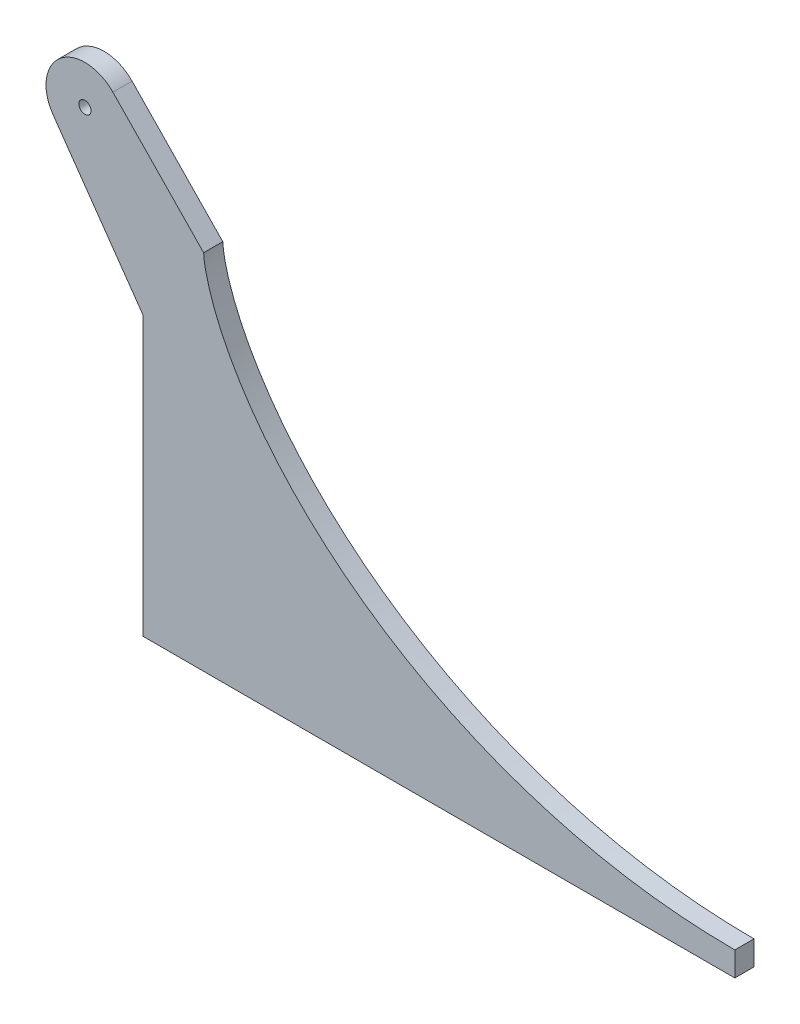
ISO-10303-21;
HEADER;
FILE_DESCRIPTION(('STEP AP214'),'2;1');
FILE_NAME('part.step','',(''),(''),'','','');
FILE_SCHEMA(('AUTOMOTIVE_DESIGN { 1 0 10303 214 1 1 1 1 }'));
ENDSEC;
DATA;
#1=APPLICATION_CONTEXT('core data for automotive mechanical design processes');
#2=APPLICATION_PROTOCOL_DEFINITION('international standard','automotive_design',2000,#1);
#3=PRODUCT_CONTEXT('',#1,'mechanical');
#4=PRODUCT('Part','Part','',(#3));
#5=PRODUCT_RELATED_PRODUCT_CATEGORY('part','',(#4));
#6=PRODUCT_DEFINITION_FORMATION('','',#4);
#7=PRODUCT_DEFINITION_CONTEXT('part definition',#1,'design');
#8=PRODUCT_DEFINITION('design','',#6,#7);
#9=PRODUCT_DEFINITION_SHAPE('','',#8);
#10=(LENGTH_UNIT() NAMED_UNIT(*) SI_UNIT(.MILLI.,.METRE.));
#11=(NAMED_UNIT(*) PLANE_ANGLE_UNIT() SI_UNIT($,.RADIAN.));
#12=(NAMED_UNIT(*) SI_UNIT($,.STERADIAN.) SOLID_ANGLE_UNIT());
#13=UNCERTAINTY_MEASURE_WITH_UNIT(LENGTH_MEASURE(1.E-05),#10,'distance_accuracy_value','');
#14=(GEOMETRIC_REPRESENTATION_CONTEXT(3) GLOBAL_UNCERTAINTY_ASSIGNED_CONTEXT((#13)) GLOBAL_UNIT_ASSIGNED_CONTEXT((#10,
#11,#12)) REPRESENTATION_CONTEXT('',''));
#15=CARTESIAN_POINT('',(0.,0.,0.));
#16=DIRECTION('',(0.,0.,1.));
#17=DIRECTION('',(1.,0.,0.));
#18=AXIS2_PLACEMENT_3D('',#15,#16,#17);
#19=CARTESIAN_POINT('',(-154.481439557848,-6.35,2.5));
#20=DIRECTION('',(0.,1.,0.));
#21=DIRECTION('',(0.,0.,1.));
#22=AXIS2_PLACEMENT_3D('',#19,#20,#21);
#23=PLANE('',#22);
#24=DIRECTION('',(1.,0.,0.));
#25=VECTOR('',#24,1.);
#26=CARTESIAN_POINT('',(-154.481439557848,-6.35,-2.5));
#27=LINE('',#26,#25);
#28=CARTESIAN_POINT('',(-154.481439557848,-6.35,-2.5));
#29=VERTEX_POINT('',#28);
#30=CARTESIAN_POINT('',(0.,-6.35,-2.5));
#31=VERTEX_POINT('',#30);
#32=EDGE_CURVE('E135',#29,#31,#27,.T.);
#33=ORIENTED_EDGE('',*,*,#32,.T.);
#34=DIRECTION('',(0.,0.,-1.));
#35=VECTOR('',#34,1.);
#36=CARTESIAN_POINT('',(0.,-6.35,2.5));
#37=LINE('',#36,#35);
#38=CARTESIAN_POINT('',(0.,-6.35,2.5));
#39=VERTEX_POINT('',#38);
#40=EDGE_CURVE('E13',#39,#31,#37,.T.);
#41=ORIENTED_EDGE('',*,*,#40,.F.);
#42=DIRECTION('',(1.,0.,0.));
#43=VECTOR('',#42,1.);
#44=CARTESIAN_POINT('',(-154.481439557848,-6.35,2.5));
#45=LINE('',#44,#43);
#46=CARTESIAN_POINT('',(-154.481439557848,-6.35,2.5));
#47=VERTEX_POINT('',#46);
#48=EDGE_CURVE('E153',#47,#39,#45,.T.);
#49=ORIENTED_EDGE('',*,*,#48,.F.);
#50=DIRECTION('',(0.,0.,-1.));
#51=VECTOR('',#50,1.);
#52=CARTESIAN_POINT('',(-154.481439557848,-6.35,2.5));
#53=LINE('',#52,#51);
#54=EDGE_CURVE('E131',#47,#29,#53,.T.);
#55=ORIENTED_EDGE('',*,*,#54,.T.);
#56=EDGE_LOOP('',(#33,#41,#49,#55));
#57=FACE_BOUND('',#56,.T.);
#58=ADVANCED_FACE('F45',(#57),#23,.F.);
#59=CARTESIAN_POINT('',(0.,-6.35,2.5));
#60=DIRECTION('',(-1.,0.,0.));
#61=DIRECTION('',(0.,0.,1.));
#62=AXIS2_PLACEMENT_3D('',#59,#60,#61);
#63=PLANE('',#62);
#64=DIRECTION('',(0.,1.,0.));
#65=VECTOR('',#64,1.);
#66=CARTESIAN_POINT('',(0.,-6.35,-2.5));
#67=LINE('',#66,#65);
#68=CARTESIAN_POINT('',(-3.2225814361377E-12,-4.70224750895336E-12,-2.5));
#69=VERTEX_POINT('',#68);
#70=EDGE_CURVE('E138',#31,#69,#67,.T.);
#71=ORIENTED_EDGE('',*,*,#70,.T.);
#72=DIRECTION('',(0.,0.,-1.));
#73=VECTOR('',#72,1.);
#74=CARTESIAN_POINT('',(-3.2225814361377E-12,-4.70224750895336E-12,2.5));
#75=LINE('',#74,#73);
#76=CARTESIAN_POINT('',(-3.2225814361377E-12,-4.70224750895336E-12,2.5));
#77=VERTEX_POINT('',#76);
#78=EDGE_CURVE('E53',#77,#69,#75,.T.);
#79=ORIENTED_EDGE('',*,*,#78,.F.);
#80=DIRECTION('',(0.,1.,0.));
#81=VECTOR('',#80,1.);
#82=CARTESIAN_POINT('',(0.,-6.35,2.5));
#83=LINE('',#82,#81);
#84=EDGE_CURVE('E101',#39,#77,#83,.T.);
#85=ORIENTED_EDGE('',*,*,#84,.F.);
#86=ORIENTED_EDGE('',*,*,#40,.T.);
#87=EDGE_LOOP('',(#71,#79,#85,#86));
#88=FACE_BOUND('',#87,.T.);
#89=ADVANCED_FACE('F184',(#88),#63,.F.);
#90=CARTESIAN_POINT('',(-3.2225814361377E-12,-4.70224750895336E-12,2.5));
#91=CARTESIAN_POINT('',(-0.315317675874365,-4.69539859235683E-12,2.5));
#92=CARTESIAN_POINT('',(-0.933202849632873,0.00181783838299916,2.5));
#93=CARTESIAN_POINT('',(-2.47711007242748,0.012428267788323,2.5));
#94=CARTESIAN_POINT('',(-4.35262006032526,0.0486470431453486,2.5));
#95=CARTESIAN_POINT('',(-7.3920123031344,0.139524343280071,2.5));
#96=CARTESIAN_POINT('',(-11.2783706242876,0.337947753305324,2.5));
#97=CARTESIAN_POINT('',(-15.8882256254125,0.683225410036247,2.5));
#98=CARTESIAN_POINT('',(-20.4355738967618,1.16504353497669,2.5));
#99=CARTESIAN_POINT('',(-24.3494332777357,1.67555944270521,2.5));
#100=CARTESIAN_POINT('',(-27.5868495583608,2.16600876140991,2.5));
#101=CARTESIAN_POINT('',(-30.1777357864607,2.59737994500898,2.5));
#102=CARTESIAN_POINT('',(-34.6941199005702,3.42054947239641,2.5));
#103=CARTESIAN_POINT('',(-41.1115016111657,4.79156365075683,2.5));
#104=CARTESIAN_POINT('',(-49.3653476835306,6.95424410733547,2.5));
#105=CARTESIAN_POINT('',(-59.340712587809,10.2401904320737,2.5));
#106=CARTESIAN_POINT('',(-69.08821911946,14.1503209254391,2.5));
#107=CARTESIAN_POINT('',(-78.562226683604,18.6846377219219,2.5));
#108=CARTESIAN_POINT('',(-87.7118299875412,23.8431383752298,2.5));
#109=CARTESIAN_POINT('',(-96.4812397590231,29.6258243584369,2.5));
#110=CARTESIAN_POINT('',(-104.806706423707,36.032698765365,2.5));
#111=CARTESIAN_POINT('',(-111.846477365907,42.3725486575921,2.5));
#112=CARTESIAN_POINT('',(-117.499907722486,48.2547797602766,2.5));
#113=CARTESIAN_POINT('',(-121.922980853757,53.4759848497702,2.5));
#114=CARTESIAN_POINT('',(-125.278396766732,57.8718013875356,2.5));
#115=CARTESIAN_POINT('',(-128.248792738205,62.2008761375249,2.5));
#116=CARTESIAN_POINT('',(-130.978665346063,66.6860112860701,2.5));
#117=CARTESIAN_POINT('',(-133.427089014441,71.3116257772703,2.5));
#118=CARTESIAN_POINT('',(-135.381511975903,75.692405852999,2.5));
#119=CARTESIAN_POINT('',(-136.709143665814,79.332808223133,2.5));
#120=CARTESIAN_POINT('',(-137.543893871889,82.1639404648542,2.5));
#121=CARTESIAN_POINT('',(-137.997774345649,84.0390428440237,2.5));
#122=CARTESIAN_POINT('',(-138.262733572859,85.3401653908125,2.5));
#123=CARTESIAN_POINT('',(-138.425196169405,86.3365819080089,2.5));
#124=CARTESIAN_POINT('',(-138.514302662478,87.0234266522157,2.5));
#125=CARTESIAN_POINT('',(-138.563362588891,87.5118332112473,2.5));
#126=CARTESIAN_POINT('',(-138.584504008792,87.7679735813505,2.5));
#127=CARTESIAN_POINT('',(-138.597757084802,87.9820401675203,2.5));
#128=CARTESIAN_POINT('',(-138.604893223751,88.1343321372545,2.5));
#129=CARTESIAN_POINT('',(-138.606439557848,88.2064800640192,2.5));
#130=CARTESIAN_POINT('',(-138.606439557848,88.2395999999881,2.5));
#131=B_SPLINE_CURVE_WITH_KNOTS('',4,(#90,#91,#92,#93,#94,#95,#96,#97,#98,#99,#100,#101,#102,
#103,#104,#105,#106,#107,#108,#109,#110,#111,#112,#113,#114,#115,#116,#117,#118,#119,#120,#121,
#122,#123,#124,#125,#126,#127,#128,#129,#130),.UNSPECIFIED.,.F.,.F.,(5,1,1,1,1,1,1,1,1,1,1,1,1,
1,1,1,1,1,1,1,1,1,1,1,1,1,1,1,1,1,1,1,1,1,1,1,1,5),(0.,0.00714685234854406,0.0142937046970881,
0.0278100161819966,0.041326327666905,0.0683589506367218,0.0953915690676178,0.122424187498514,
0.135940507742665,0.149456827986817,0.162973148230968,0.176489468475119,0.23055470638387,
0.2846199583885,0.338685154899743,0.392750482754099,0.446815660466263,0.500880994772262,
0.554946113506155,0.609011486457256,0.66307674621025,0.695881901929337,0.722914604188303,
0.749947156366306,0.776979831732039,0.804012310218606,0.831045129756175,0.857715393502871,
0.875737588033686,0.88378511771394,0.891832647394193,0.897460088824633,0.903087530255073,
0.90458889418278,0.906090258110487,0.907591622038194,0.908342304002048,0.909092985965901),.UNSPECIFIED.);
#132=DIRECTION('',(0.,0.,-1.));
#133=VECTOR('',#132,1.);
#134=SURFACE_OF_LINEAR_EXTRUSION('',#131,#133);
#135=CARTESIAN_POINT('',(-3.2225814361377E-12,-4.70224750895336E-12,-2.5));
#136=CARTESIAN_POINT('',(-0.315317675874365,-4.69539859235683E-12,-2.5));
#137=CARTESIAN_POINT('',(-0.933202849632873,0.00181783838299916,-2.5));
#138=CARTESIAN_POINT('',(-2.47711007242748,0.012428267788323,-2.5));
#139=CARTESIAN_POINT('',(-4.35262006032526,0.0486470431453486,-2.5));
#140=CARTESIAN_POINT('',(-7.3920123031344,0.139524343280071,-2.5));
#141=CARTESIAN_POINT('',(-11.2783706242876,0.337947753305324,-2.5));
#142=CARTESIAN_POINT('',(-15.8882256254125,0.683225410036247,-2.5));
#143=CARTESIAN_POINT('',(-20.4355738967618,1.16504353497669,-2.5));
#144=CARTESIAN_POINT('',(-24.3494332777357,1.67555944270521,-2.5));
#145=CARTESIAN_POINT('',(-27.5868495583608,2.16600876140991,-2.5));
#146=CARTESIAN_POINT('',(-30.1777357864607,2.59737994500898,-2.5));
#147=CARTESIAN_POINT('',(-34.6941199005702,3.42054947239641,-2.5));
#148=CARTESIAN_POINT('',(-41.1115016111657,4.79156365075683,-2.5));
#149=CARTESIAN_POINT('',(-49.3653476835306,6.95424410733547,-2.5));
#150=CARTESIAN_POINT('',(-59.340712587809,10.2401904320737,-2.5));
#151=CARTESIAN_POINT('',(-69.08821911946,14.1503209254391,-2.5));
#152=CARTESIAN_POINT('',(-78.562226683604,18.6846377219219,-2.5));
#153=CARTESIAN_POINT('',(-87.7118299875412,23.8431383752298,-2.5));
#154=CARTESIAN_POINT('',(-96.4812397590231,29.6258243584369,-2.5));
#155=CARTESIAN_POINT('',(-104.806706423707,36.032698765365,-2.5));
#156=CARTESIAN_POINT('',(-111.846477365907,42.3725486575921,-2.5));
#157=CARTESIAN_POINT('',(-117.499907722486,48.2547797602766,-2.5));
#158=CARTESIAN_POINT('',(-121.922980853757,53.4759848497702,-2.5));
#159=CARTESIAN_POINT('',(-125.278396766732,57.8718013875356,-2.5));
#160=CARTESIAN_POINT('',(-128.248792738205,62.2008761375249,-2.5));
#161=CARTESIAN_POINT('',(-130.978665346063,66.6860112860701,-2.5));
#162=CARTESIAN_POINT('',(-133.427089014441,71.3116257772703,-2.5));
#163=CARTESIAN_POINT('',(-135.381511975903,75.692405852999,-2.5));
#164=CARTESIAN_POINT('',(-136.709143665814,79.332808223133,-2.5));
#165=CARTESIAN_POINT('',(-137.543893871889,82.1639404648542,-2.5));
#166=CARTESIAN_POINT('',(-137.997774345649,84.0390428440237,-2.5));
#167=CARTESIAN_POINT('',(-138.262733572859,85.3401653908125,-2.5));
#168=CARTESIAN_POINT('',(-138.425196169405,86.3365819080089,-2.5));
#169=CARTESIAN_POINT('',(-138.514302662478,87.0234266522157,-2.5));
#170=CARTESIAN_POINT('',(-138.563362588891,87.5118332112473,-2.5));
#171=CARTESIAN_POINT('',(-138.584504008792,87.7679735813505,-2.5));
#172=CARTESIAN_POINT('',(-138.597757084802,87.9820401675203,-2.5));
#173=CARTESIAN_POINT('',(-138.604893223751,88.1343321372545,-2.5));
#174=CARTESIAN_POINT('',(-138.606439557848,88.2064800640192,-2.5));
#175=CARTESIAN_POINT('',(-138.606439557848,88.2395999999881,-2.5));
#176=B_SPLINE_CURVE_WITH_KNOTS('',4,(#135,#136,#137,#138,#139,#140,#141,#142,#143,#144,#145,
#146,#147,#148,#149,#150,#151,#152,#153,#154,#155,#156,#157,#158,#159,#160,#161,#162,#163,#164,
#165,#166,#167,#168,#169,#170,#171,#172,#173,#174,#175),.UNSPECIFIED.,.F.,.F.,(5,1,1,1,1,1,1,1,
1,1,1,1,1,1,1,1,1,1,1,1,1,1,1,1,1,1,1,1,1,1,1,1,1,1,1,1,1,5),(0.,0.00714685234854406,
0.0142937046970881,0.0278100161819966,0.041326327666905,0.0683589506367218,0.0953915690676178,
0.122424187498514,0.135940507742665,0.149456827986817,0.162973148230968,0.176489468475119,
0.23055470638387,0.2846199583885,0.338685154899743,0.392750482754099,0.446815660466263,
0.500880994772262,0.554946113506155,0.609011486457256,0.66307674621025,0.695881901929337,
0.722914604188303,0.749947156366306,0.776979831732039,0.804012310218606,0.831045129756175,
0.857715393502871,0.875737588033686,0.88378511771394,0.891832647394193,0.897460088824633,
0.903087530255073,0.90458889418278,0.906090258110487,0.907591622038194,0.908342304002048,
0.909092985965901),.UNSPECIFIED.);
#177=CARTESIAN_POINT('',(-138.606439557848,88.2395999999894,-2.5));
#178=VERTEX_POINT('',#177);
#179=EDGE_CURVE('E141',#69,#178,#176,.T.);
#180=ORIENTED_EDGE('',*,*,#179,.T.);
#181=DIRECTION('',(0.,0.,-1.));
#182=VECTOR('',#181,1.);
#183=CARTESIAN_POINT('',(-138.606439557848,88.2395999999894,2.5));
#184=LINE('',#183,#182);
#185=CARTESIAN_POINT('',(-138.606439557848,88.2395999999894,2.5));
#186=VERTEX_POINT('',#185);
#187=EDGE_CURVE('E157',#186,#178,#184,.T.);
#188=ORIENTED_EDGE('',*,*,#187,.F.);
#189=EDGE_CURVE('E165',#77,#186,#131,.T.);
#190=ORIENTED_EDGE('',*,*,#189,.F.);
#191=ORIENTED_EDGE('',*,*,#78,.T.);
#192=EDGE_LOOP('',(#180,#188,#190,#191));
#193=FACE_BOUND('',#192,.T.);
#194=ADVANCED_FACE('F163',(#193),#134,.F.);
#195=CARTESIAN_POINT('',(-162.274426084797,112.681888077645,2.5));
#196=DIRECTION('',(-0.718394139499904,-0.695636298889148,0.));
#197=DIRECTION('',(0.695636298889148,-0.718394139499904,0.));
#198=AXIS2_PLACEMENT_3D('',#195,#196,#197);
#199=PLANE('',#198);
#200=DIRECTION('',(-0.695636298889148,0.718394139499904,0.));
#201=VECTOR('',#200,1.);
#202=CARTESIAN_POINT('',(-162.274426084797,112.681888077645,-2.5));
#203=LINE('',#202,#201);
#204=CARTESIAN_POINT('',(-162.274426084797,112.681888077645,-2.5));
#205=VERTEX_POINT('',#204);
#206=EDGE_CURVE('E145',#178,#205,#203,.T.);
#207=ORIENTED_EDGE('',*,*,#206,.T.);
#208=DIRECTION('',(0.,0.,-1.));
#209=VECTOR('',#208,1.);
#210=CARTESIAN_POINT('',(-162.274426084797,112.681888077645,2.5));
#211=LINE('',#210,#209);
#212=CARTESIAN_POINT('',(-162.274426084797,112.681888077645,2.5));
#213=VERTEX_POINT('',#212);
#214=EDGE_CURVE('E126',#213,#205,#211,.T.);
#215=ORIENTED_EDGE('',*,*,#214,.F.);
#216=DIRECTION('',(-0.695636298889148,0.718394139499904,0.));
#217=VECTOR('',#216,1.);
#218=CARTESIAN_POINT('',(-162.274426084797,112.681888077645,2.5));
#219=LINE('',#218,#217);
#220=EDGE_CURVE('E117',#186,#213,#219,.T.);
#221=ORIENTED_EDGE('',*,*,#220,.F.);
#222=ORIENTED_EDGE('',*,*,#187,.T.);
#223=EDGE_LOOP('',(#207,#215,#221,#222));
#224=FACE_BOUND('',#223,.T.);
#225=ADVANCED_FACE('F171',(#224),#199,.F.);
#226=CARTESIAN_POINT('',(-169.573310542116,105.614223280931,2.5));
#227=DIRECTION('',(0.,0.,-1.));
#228=DIRECTION('',(-1.,0.,0.));
#229=AXIS2_PLACEMENT_3D('',#226,#227,#228);
#230=CYLINDRICAL_SURFACE('',#229,10.16);
#231=CARTESIAN_POINT('',(-169.573310542116,105.614223280931,-2.5));
#232=DIRECTION('',(0.,0.,1.));
#233=DIRECTION('',(-1.,0.,0.));
#234=AXIS2_PLACEMENT_3D('',#231,#232,#233);
#235=CIRCLE('',#234,10.16);
#236=CARTESIAN_POINT('',(-177.895895312092,99.7866866876049,-2.5));
#237=VERTEX_POINT('',#236);
#238=EDGE_CURVE('E125',#205,#237,#235,.T.);
#239=ORIENTED_EDGE('',*,*,#238,.T.);
#240=DIRECTION('',(0.,0.,-1.));
#241=VECTOR('',#240,1.);
#242=CARTESIAN_POINT('',(-177.895895312092,99.7866866876049,2.5));
#243=LINE('',#242,#241);
#244=CARTESIAN_POINT('',(-177.895895312092,99.7866866876049,2.5));
#245=VERTEX_POINT('',#244);
#246=EDGE_CURVE('E122',#245,#237,#243,.T.);
#247=ORIENTED_EDGE('',*,*,#246,.F.);
#248=CARTESIAN_POINT('',(-169.573310542116,105.614223280931,2.5));
#249=DIRECTION('',(0.,0.,1.));
#250=DIRECTION('',(-1.,0.,0.));
#251=AXIS2_PLACEMENT_3D('',#248,#249,#250);
#252=CIRCLE('',#251,10.16);
#253=EDGE_CURVE('E111',#213,#245,#252,.T.);
#254=ORIENTED_EDGE('',*,*,#253,.F.);
#255=ORIENTED_EDGE('',*,*,#214,.T.);
#256=EDGE_LOOP('',(#239,#247,#254,#255));
#257=FACE_BOUND('',#256,.T.);
#258=ADVANCED_FACE('F123',(#257),#230,.T.);
#259=CARTESIAN_POINT('',(-177.895895312092,99.7866866876049,2.5));
#260=DIRECTION('',(0.819152044288995,0.573576436351042,0.));
#261=DIRECTION('',(-0.573576436351042,0.819152044288995,0.));
#262=AXIS2_PLACEMENT_3D('',#259,#260,#261);
#263=PLANE('',#262);
#264=DIRECTION('',(0.573576436351042,-0.819152044288995,0.));
#265=VECTOR('',#264,1.);
#266=CARTESIAN_POINT('',(-177.895895312092,99.7866866876049,-2.5));
#267=LINE('',#266,#265);
#268=CARTESIAN_POINT('',(-154.481439557848,66.3473783732292,-2.5));
#269=VERTEX_POINT('',#268);
#270=EDGE_CURVE('E87',#237,#269,#267,.T.);
#271=ORIENTED_EDGE('',*,*,#270,.T.);
#272=DIRECTION('',(0.,0.,-1.));
#273=VECTOR('',#272,1.);
#274=CARTESIAN_POINT('',(-154.481439557848,66.3473783732292,2.5));
#275=LINE('',#274,#273);
#276=CARTESIAN_POINT('',(-154.481439557848,66.3473783732292,2.5));
#277=VERTEX_POINT('',#276);
#278=EDGE_CURVE('E127',#277,#269,#275,.T.);
#279=ORIENTED_EDGE('',*,*,#278,.F.);
#280=DIRECTION('',(0.573576436351042,-0.819152044288995,0.));
#281=VECTOR('',#280,1.);
#282=CARTESIAN_POINT('',(-177.895895312092,99.7866866876049,2.5));
#283=LINE('',#282,#281);
#284=EDGE_CURVE('E115',#245,#277,#283,.T.);
#285=ORIENTED_EDGE('',*,*,#284,.F.);
#286=ORIENTED_EDGE('',*,*,#246,.T.);
#287=EDGE_LOOP('',(#271,#279,#285,#286));
#288=FACE_BOUND('',#287,.T.);
#289=ADVANCED_FACE('F129',(#288),#263,.F.);
#290=CARTESIAN_POINT('',(-154.481439557848,-6.35,2.5));
#291=DIRECTION('',(1.,0.,0.));
#292=DIRECTION('',(0.,0.,-1.));
#293=AXIS2_PLACEMENT_3D('',#290,#291,#292);
#294=PLANE('',#293);
#295=DIRECTION('',(0.,-1.,0.));
#296=VECTOR('',#295,1.);
#297=CARTESIAN_POINT('',(-154.481439557848,-6.35,-2.5));
#298=LINE('',#297,#296);
#299=EDGE_CURVE('E93',#269,#29,#298,.T.);
#300=ORIENTED_EDGE('',*,*,#299,.T.);
#301=ORIENTED_EDGE('',*,*,#54,.F.);
#302=DIRECTION('',(0.,-1.,0.));
#303=VECTOR('',#302,1.);
#304=CARTESIAN_POINT('',(-154.481439557848,-6.35,2.5));
#305=LINE('',#304,#303);
#306=EDGE_CURVE('E61',#277,#47,#305,.T.);
#307=ORIENTED_EDGE('',*,*,#306,.F.);
#308=ORIENTED_EDGE('',*,*,#278,.T.);
#309=EDGE_LOOP('',(#300,#301,#307,#308));
#310=FACE_BOUND('',#309,.T.);
#311=ADVANCED_FACE('F193',(#310),#294,.F.);
#312=CARTESIAN_POINT('',(-84.411015264639,22.0598996205078,2.5));
#313=DIRECTION('',(0.,0.,-1.));
#314=DIRECTION('',(-1.,0.,0.));
#315=AXIS2_PLACEMENT_3D('',#312,#313,#314);
#316=PLANE('',#315);
#317=CARTESIAN_POINT('',(-169.573310542116,105.614223280931,2.5));
#318=DIRECTION('',(0.,0.,1.));
#319=DIRECTION('',(1.,0.,0.));
#320=AXIS2_PLACEMENT_3D('',#317,#318,#319);
#321=CIRCLE('',#320,1.58749999999999);
#322=CARTESIAN_POINT('',(-167.985810542116,105.614223280931,2.5));
#323=VERTEX_POINT('',#322);
#324=EDGE_CURVE('E272',#323,#323,#321,.T.);
#325=ORIENTED_EDGE('',*,*,#324,.F.);
#326=EDGE_LOOP('',(#325));
#327=FACE_BOUND('',#326,.T.);
#328=ORIENTED_EDGE('',*,*,#48,.T.);
#329=ORIENTED_EDGE('',*,*,#84,.T.);
#330=ORIENTED_EDGE('',*,*,#189,.T.);
#331=ORIENTED_EDGE('',*,*,#220,.T.);
#332=ORIENTED_EDGE('',*,*,#253,.T.);
#333=ORIENTED_EDGE('',*,*,#284,.T.);
#334=ORIENTED_EDGE('',*,*,#306,.T.);
#335=EDGE_LOOP('',(#328,#329,#330,#331,#332,#333,#334));
#336=FACE_BOUND('',#335,.T.);
#337=ADVANCED_FACE('F113',(#327,#336),#316,.F.);
#338=CARTESIAN_POINT('',(-84.411015264639,22.0598996205078,-2.5));
#339=DIRECTION('',(0.,0.,-1.));
#340=DIRECTION('',(-1.,0.,0.));
#341=AXIS2_PLACEMENT_3D('',#338,#339,#340);
#342=PLANE('',#341);
#343=CARTESIAN_POINT('',(-169.573310542116,105.614223280931,-2.5));
#344=DIRECTION('',(0.,0.,1.));
#345=DIRECTION('',(1.,0.,0.));
#346=AXIS2_PLACEMENT_3D('',#343,#344,#345);
#347=CIRCLE('',#346,1.58749999999999);
#348=CARTESIAN_POINT('',(-167.985810542116,105.614223280931,-2.5));
#349=VERTEX_POINT('',#348);
#350=EDGE_CURVE('E139',#349,#349,#347,.T.);
#351=ORIENTED_EDGE('',*,*,#350,.T.);
#352=EDGE_LOOP('',(#351));
#353=FACE_BOUND('',#352,.T.);
#354=ORIENTED_EDGE('',*,*,#32,.F.);
#355=ORIENTED_EDGE('',*,*,#299,.F.);
#356=ORIENTED_EDGE('',*,*,#270,.F.);
#357=ORIENTED_EDGE('',*,*,#238,.F.);
#358=ORIENTED_EDGE('',*,*,#206,.F.);
#359=ORIENTED_EDGE('',*,*,#179,.F.);
#360=ORIENTED_EDGE('',*,*,#70,.F.);
#361=EDGE_LOOP('',(#354,#355,#356,#357,#358,#359,#360));
#362=FACE_BOUND('',#361,.T.);
#363=ADVANCED_FACE('F169',(#353,#362),#342,.T.);
#364=CARTESIAN_POINT('',(-169.573310542116,105.614223280931,-2.5));
#365=DIRECTION('',(0.,0.,1.));
#366=DIRECTION('',(1.,0.,0.));
#367=AXIS2_PLACEMENT_3D('',#364,#365,#366);
#368=CYLINDRICAL_SURFACE('',#367,1.58749999999999);
#369=ORIENTED_EDGE('',*,*,#350,.F.);
#370=EDGE_LOOP('',(#369));
#371=FACE_BOUND('',#370,.T.);
#372=ORIENTED_EDGE('',*,*,#324,.T.);
#373=EDGE_LOOP('',(#372));
#374=FACE_BOUND('',#373,.T.);
#375=ADVANCED_FACE('F254',(#371,#374),#368,.F.);
#376=CLOSED_SHELL('',(#58,#89,#194,#225,#258,#289,#311,#337,#363,#375));
#377=MANIFOLD_SOLID_BREP('B2',#376);
#378=ADVANCED_BREP_SHAPE_REPRESENTATION('',(#18,#377),#14);
#379=SHAPE_DEFINITION_REPRESENTATION(#9,#378);
ENDSEC;
END-ISO-10303-21;
